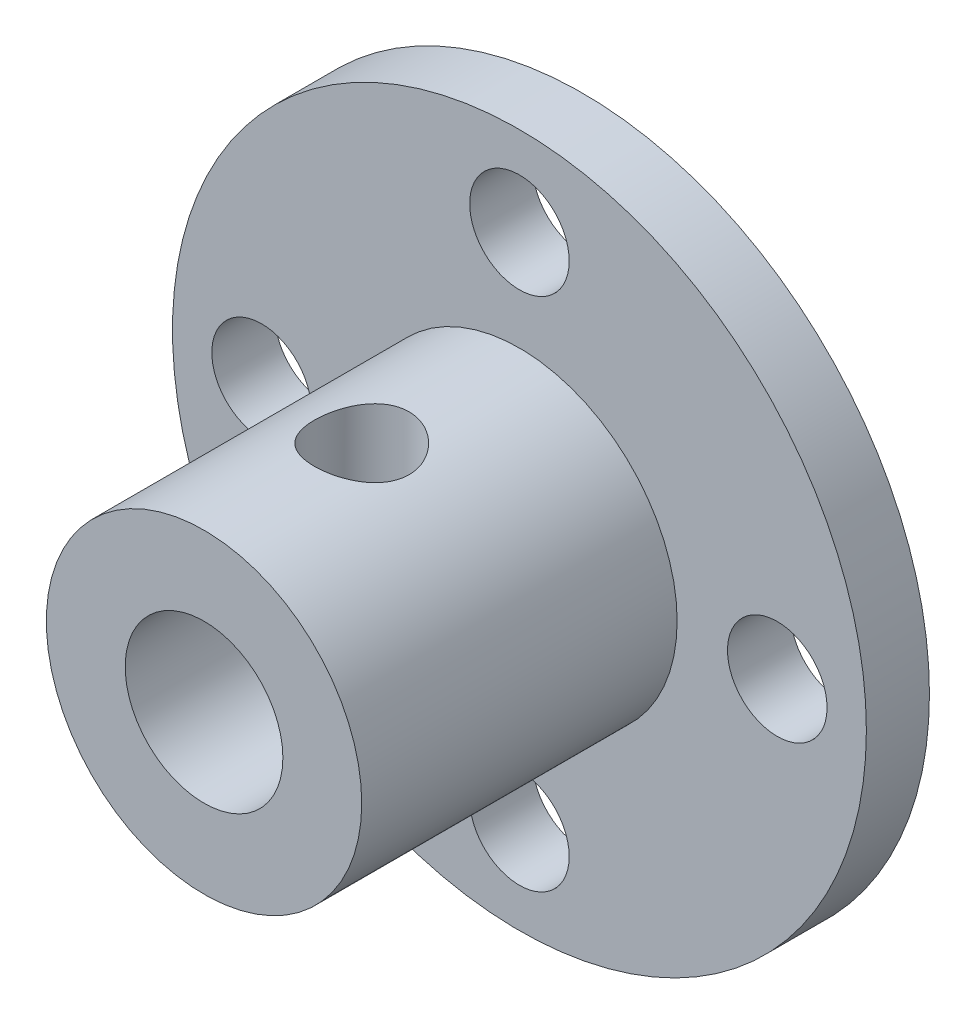
ISO-10303-21;
HEADER;
FILE_DESCRIPTION(('STEP AP214'),'2;1');
FILE_NAME('part.step','',(''),(''),'','','');
FILE_SCHEMA(('AUTOMOTIVE_DESIGN { 1 0 10303 214 1 1 1 1 }'));
ENDSEC;
DATA;
#1=APPLICATION_CONTEXT('core data for automotive mechanical design processes');
#2=APPLICATION_PROTOCOL_DEFINITION('international standard','automotive_design',2000,#1);
#3=PRODUCT_CONTEXT('',#1,'mechanical');
#4=PRODUCT('Part','Part','',(#3));
#5=PRODUCT_RELATED_PRODUCT_CATEGORY('part','',(#4));
#6=PRODUCT_DEFINITION_FORMATION('','',#4);
#7=PRODUCT_DEFINITION_CONTEXT('part definition',#1,'design');
#8=PRODUCT_DEFINITION('design','',#6,#7);
#9=PRODUCT_DEFINITION_SHAPE('','',#8);
#10=(LENGTH_UNIT() NAMED_UNIT(*) SI_UNIT(.MILLI.,.METRE.));
#11=(NAMED_UNIT(*) PLANE_ANGLE_UNIT() SI_UNIT($,.RADIAN.));
#12=(NAMED_UNIT(*) SI_UNIT($,.STERADIAN.) SOLID_ANGLE_UNIT());
#13=UNCERTAINTY_MEASURE_WITH_UNIT(LENGTH_MEASURE(1.E-05),#10,'distance_accuracy_value','');
#14=(GEOMETRIC_REPRESENTATION_CONTEXT(3) GLOBAL_UNCERTAINTY_ASSIGNED_CONTEXT((#13)) GLOBAL_UNIT_ASSIGNED_CONTEXT((#10,
#11,#12)) REPRESENTATION_CONTEXT('',''));
#15=CARTESIAN_POINT('',(0.,0.,0.));
#16=DIRECTION('',(0.,0.,1.));
#17=DIRECTION('',(1.,0.,0.));
#18=AXIS2_PLACEMENT_3D('',#15,#16,#17);
#19=CARTESIAN_POINT('',(0.,0.,2.));
#20=DIRECTION('',(0.,0.,1.));
#21=DIRECTION('',(1.,0.,0.));
#22=AXIS2_PLACEMENT_3D('',#19,#20,#21);
#23=PLANE('',#22);
#24=CARTESIAN_POINT('',(0.,-8.175,2.));
#25=DIRECTION('',(0.,0.,1.));
#26=DIRECTION('',(1.,0.,0.));
#27=AXIS2_PLACEMENT_3D('',#24,#25,#26);
#28=CIRCLE('',#27,1.57807537072648);
#29=CARTESIAN_POINT('',(1.5780753707264,-8.175,2.));
#30=VERTEX_POINT('',#29);
#31=EDGE_CURVE('E129',#30,#30,#28,.T.);
#32=ORIENTED_EDGE('',*,*,#31,.F.);
#33=EDGE_LOOP('',(#32));
#34=FACE_BOUND('',#33,.T.);
#35=CARTESIAN_POINT('',(0.,8.175,2.));
#36=DIRECTION('',(0.,0.,1.));
#37=DIRECTION('',(1.,0.,0.));
#38=AXIS2_PLACEMENT_3D('',#35,#36,#37);
#39=CIRCLE('',#38,1.57807537072648);
#40=CARTESIAN_POINT('',(1.57807537072651,8.175,2.));
#41=VERTEX_POINT('',#40);
#42=EDGE_CURVE('E143',#41,#41,#39,.T.);
#43=ORIENTED_EDGE('',*,*,#42,.F.);
#44=EDGE_LOOP('',(#43));
#45=FACE_BOUND('',#44,.T.);
#46=CARTESIAN_POINT('',(0.,0.,2.));
#47=DIRECTION('',(0.,0.,1.));
#48=DIRECTION('',(1.,0.,0.));
#49=AXIS2_PLACEMENT_3D('',#46,#47,#48);
#50=CIRCLE('',#49,11.);
#51=CARTESIAN_POINT('',(11.,0.,2.));
#52=VERTEX_POINT('',#51);
#53=EDGE_CURVE('E10',#52,#52,#50,.T.);
#54=ORIENTED_EDGE('',*,*,#53,.T.);
#55=EDGE_LOOP('',(#54));
#56=FACE_BOUND('',#55,.T.);
#57=CARTESIAN_POINT('',(-8.175,0.,2.));
#58=DIRECTION('',(0.,0.,1.));
#59=DIRECTION('',(1.,0.,0.));
#60=AXIS2_PLACEMENT_3D('',#57,#58,#59);
#61=CIRCLE('',#60,1.57807537072648);
#62=CARTESIAN_POINT('',(-6.59692462927352,0.,2.));
#63=VERTEX_POINT('',#62);
#64=EDGE_CURVE('E147',#63,#63,#61,.T.);
#65=ORIENTED_EDGE('',*,*,#64,.F.);
#66=EDGE_LOOP('',(#65));
#67=FACE_BOUND('',#66,.T.);
#68=CARTESIAN_POINT('',(8.175,0.,2.));
#69=DIRECTION('',(0.,0.,1.));
#70=DIRECTION('',(1.,0.,0.));
#71=AXIS2_PLACEMENT_3D('',#68,#69,#70);
#72=CIRCLE('',#71,1.57807537072648);
#73=CARTESIAN_POINT('',(9.75307537072649,0.,2.));
#74=VERTEX_POINT('',#73);
#75=EDGE_CURVE('E139',#74,#74,#72,.T.);
#76=ORIENTED_EDGE('',*,*,#75,.F.);
#77=EDGE_LOOP('',(#76));
#78=FACE_BOUND('',#77,.T.);
#79=CARTESIAN_POINT('',(0.,0.,2.));
#80=DIRECTION('',(0.,0.,1.));
#81=DIRECTION('',(1.,0.,0.));
#82=AXIS2_PLACEMENT_3D('',#79,#80,#81);
#83=CIRCLE('',#82,5.);
#84=CARTESIAN_POINT('',(5.,0.,2.));
#85=VERTEX_POINT('',#84);
#86=EDGE_CURVE('E135',#85,#85,#83,.T.);
#87=ORIENTED_EDGE('',*,*,#86,.F.);
#88=EDGE_LOOP('',(#87));
#89=FACE_BOUND('',#88,.T.);
#90=ADVANCED_FACE('F37',(#34,#45,#56,#67,#78,#89),#23,.T.);
#91=CARTESIAN_POINT('',(0.,0.,0.));
#92=DIRECTION('',(0.,0.,1.));
#93=DIRECTION('',(1.,0.,0.));
#94=AXIS2_PLACEMENT_3D('',#91,#92,#93);
#95=PLANE('',#94);
#96=CARTESIAN_POINT('',(0.,0.,0.));
#97=DIRECTION('',(0.,0.,1.));
#98=DIRECTION('',(1.,0.,0.));
#99=AXIS2_PLACEMENT_3D('',#96,#97,#98);
#100=CIRCLE('',#99,11.);
#101=CARTESIAN_POINT('',(11.,0.,0.));
#102=VERTEX_POINT('',#101);
#103=EDGE_CURVE('E50',#102,#102,#100,.T.);
#104=ORIENTED_EDGE('',*,*,#103,.F.);
#105=EDGE_LOOP('',(#104));
#106=FACE_BOUND('',#105,.T.);
#107=CARTESIAN_POINT('',(0.,0.,0.));
#108=DIRECTION('',(0.,0.,1.));
#109=DIRECTION('',(1.,0.,0.));
#110=AXIS2_PLACEMENT_3D('',#107,#108,#109);
#111=CIRCLE('',#110,2.5);
#112=CARTESIAN_POINT('',(2.5,0.,0.));
#113=VERTEX_POINT('',#112);
#114=EDGE_CURVE('E55',#113,#113,#111,.T.);
#115=ORIENTED_EDGE('',*,*,#114,.T.);
#116=EDGE_LOOP('',(#115));
#117=FACE_BOUND('',#116,.T.);
#118=CARTESIAN_POINT('',(-8.175,0.,0.));
#119=DIRECTION('',(0.,0.,1.));
#120=DIRECTION('',(1.,0.,0.));
#121=AXIS2_PLACEMENT_3D('',#118,#119,#120);
#122=CIRCLE('',#121,1.57807537072648);
#123=CARTESIAN_POINT('',(-6.59692462927352,0.,0.));
#124=VERTEX_POINT('',#123);
#125=EDGE_CURVE('E116',#124,#124,#122,.T.);
#126=ORIENTED_EDGE('',*,*,#125,.T.);
#127=EDGE_LOOP('',(#126));
#128=FACE_BOUND('',#127,.T.);
#129=CARTESIAN_POINT('',(0.,8.175,0.));
#130=DIRECTION('',(0.,0.,1.));
#131=DIRECTION('',(1.,0.,0.));
#132=AXIS2_PLACEMENT_3D('',#129,#130,#131);
#133=CIRCLE('',#132,1.57807537072648);
#134=CARTESIAN_POINT('',(1.57807537072651,8.175,0.));
#135=VERTEX_POINT('',#134);
#136=EDGE_CURVE('E120',#135,#135,#133,.T.);
#137=ORIENTED_EDGE('',*,*,#136,.T.);
#138=EDGE_LOOP('',(#137));
#139=FACE_BOUND('',#138,.T.);
#140=CARTESIAN_POINT('',(8.175,0.,0.));
#141=DIRECTION('',(0.,0.,1.));
#142=DIRECTION('',(1.,0.,0.));
#143=AXIS2_PLACEMENT_3D('',#140,#141,#142);
#144=CIRCLE('',#143,1.57807537072648);
#145=CARTESIAN_POINT('',(9.75307537072649,0.,0.));
#146=VERTEX_POINT('',#145);
#147=EDGE_CURVE('E124',#146,#146,#144,.T.);
#148=ORIENTED_EDGE('',*,*,#147,.T.);
#149=EDGE_LOOP('',(#148));
#150=FACE_BOUND('',#149,.T.);
#151=CARTESIAN_POINT('',(0.,-8.175,0.));
#152=DIRECTION('',(0.,0.,1.));
#153=DIRECTION('',(1.,0.,0.));
#154=AXIS2_PLACEMENT_3D('',#151,#152,#153);
#155=CIRCLE('',#154,1.57807537072648);
#156=CARTESIAN_POINT('',(1.5780753707264,-8.175,0.));
#157=VERTEX_POINT('',#156);
#158=EDGE_CURVE('E127',#157,#157,#155,.T.);
#159=ORIENTED_EDGE('',*,*,#158,.T.);
#160=EDGE_LOOP('',(#159));
#161=FACE_BOUND('',#160,.T.);
#162=ADVANCED_FACE('F100',(#106,#117,#128,#139,#150,#161),#95,.F.);
#163=CARTESIAN_POINT('',(0.,0.,2.));
#164=DIRECTION('',(0.,0.,-1.));
#165=DIRECTION('',(-1.,0.,0.));
#166=AXIS2_PLACEMENT_3D('',#163,#164,#165);
#167=CYLINDRICAL_SURFACE('',#166,11.);
#168=ORIENTED_EDGE('',*,*,#53,.F.);
#169=EDGE_LOOP('',(#168));
#170=FACE_BOUND('',#169,.T.);
#171=ORIENTED_EDGE('',*,*,#103,.T.);
#172=EDGE_LOOP('',(#171));
#173=FACE_BOUND('',#172,.T.);
#174=ADVANCED_FACE('F39',(#170,#173),#167,.T.);
#175=CARTESIAN_POINT('',(0.,0.,2.));
#176=DIRECTION('',(0.,0.,-1.));
#177=DIRECTION('',(-1.,0.,0.));
#178=AXIS2_PLACEMENT_3D('',#175,#176,#177);
#179=CYLINDRICAL_SURFACE('',#178,2.5);
#180=CARTESIAN_POINT('',(0.,-2.5,8.5));
#181=CARTESIAN_POINT('',(0.0767298334620157,-2.49999625789733,8.49999590899012));
#182=CARTESIAN_POINT('',(0.153582320644178,-2.4964290461501,8.49407132907374));
#183=CARTESIAN_POINT('',(0.304975509530678,-2.48249903608568,8.47067568048467));
#184=CARTESIAN_POINT('',(0.379510034596047,-2.47211948032719,8.45317613814578));
#185=CARTESIAN_POINT('',(0.523751827790836,-2.44561558054488,8.40761363883315));
#186=CARTESIAN_POINT('',(0.593481028226565,-2.42951973272944,8.37960304183684));
#187=CARTESIAN_POINT('',(0.727030318214657,-2.39295367626407,8.31413966685897));
#188=CARTESIAN_POINT('',(0.790851869416382,-2.37248455380255,8.27668923303126));
#189=CARTESIAN_POINT('',(0.916299278999314,-2.32705360719088,8.19022517329142));
#190=CARTESIAN_POINT('',(0.977384020081414,-2.30186792195985,8.14054630464861));
#191=CARTESIAN_POINT('',(1.09088270411891,-2.25030439279634,8.03253279617173));
#192=CARTESIAN_POINT('',(1.14328534948112,-2.22392505153571,7.97418706281268));
#193=CARTESIAN_POINT('',(1.24444996762974,-2.1691106699591,7.84207648950327));
#194=CARTESIAN_POINT('',(1.29197766378809,-2.14082017703649,7.76729822901871));
#195=CARTESIAN_POINT('',(1.37361437764896,-2.08938301412124,7.60915342675689));
#196=CARTESIAN_POINT('',(1.4077451733516,-2.06622802273938,7.52580110375243));
#197=CARTESIAN_POINT('',(1.45440601714221,-2.0335462966093,7.37340354934676));
#198=CARTESIAN_POINT('',(1.47016197246826,-2.02207883137591,7.30576400138969));
#199=CARTESIAN_POINT('',(1.49216172340475,-2.00590308295503,7.16819628416964));
#200=CARTESIAN_POINT('',(1.49841734556836,-2.00118639643759,7.09827107124551));
#201=CARTESIAN_POINT('',(1.50105508796009,-1.99920922463856,6.95798850578266));
#202=CARTESIAN_POINT('',(1.49741783408419,-2.00196337012718,6.8876305749068));
#203=CARTESIAN_POINT('',(1.48046060478828,-2.01453261443741,6.74872122457241));
#204=CARTESIAN_POINT('',(1.46713334620103,-2.02435302432226,6.68017120415256));
#205=CARTESIAN_POINT('',(1.43173921881792,-2.04953186944258,6.54746975787189));
#206=CARTESIAN_POINT('',(1.40978748666087,-2.06481711652537,6.48327294607552));
#207=CARTESIAN_POINT('',(1.35795061770837,-2.09927051350828,6.35930500907188));
#208=CARTESIAN_POINT('',(1.32806257259705,-2.11844008623465,6.29953551657607));
#209=CARTESIAN_POINT('',(1.25517983184583,-2.16255327268985,6.1750159028772));
#210=CARTESIAN_POINT('',(1.21080724397723,-2.18792043372992,6.11122190704507));
#211=CARTESIAN_POINT('',(1.11291092784003,-2.23930599764381,5.99132351633298));
#212=CARTESIAN_POINT('',(1.05937845100578,-2.26532500262149,5.93522656602349));
#213=CARTESIAN_POINT('',(0.935811834382965,-2.31935504958317,5.82438701817824));
#214=CARTESIAN_POINT('',(0.864517682704955,-2.34713836268532,5.77092269398401));
#215=CARTESIAN_POINT('',(0.712276050458998,-2.39772428433981,5.67687795280209));
#216=CARTESIAN_POINT('',(0.631333763943562,-2.42052955425515,5.63629064621005));
#217=CARTESIAN_POINT('',(0.467197585268205,-2.45730392066151,5.5720678172041));
#218=CARTESIAN_POINT('',(0.384467624173579,-2.47173957439704,5.54752464428409));
#219=CARTESIAN_POINT('',(0.215047895144639,-2.49218842813551,5.51298880259462));
#220=CARTESIAN_POINT('',(0.128363005661318,-2.49821172952738,5.50297868224642));
#221=CARTESIAN_POINT('',(-0.0337146143773973,-2.5009057037461,5.49849215232169));
#222=CARTESIAN_POINT('',(-0.109042473418719,-2.49873521714286,5.50209114491483));
#223=CARTESIAN_POINT('',(-0.257829401986061,-2.48778712087048,5.52042585307192));
#224=CARTESIAN_POINT('',(-0.331288509376106,-2.47900964518037,5.53516134280581));
#225=CARTESIAN_POINT('',(-0.472574932157613,-2.4559479244219,5.57454343281246));
#226=CARTESIAN_POINT('',(-0.540495750928484,-2.44180275662555,5.59894034907347));
#227=CARTESIAN_POINT('',(-0.671265749087263,-2.40913880862844,5.65667737636527));
#228=CARTESIAN_POINT('',(-0.734113924963908,-2.39061916586511,5.69001925134667));
#229=CARTESIAN_POINT('',(-0.860006262823863,-2.3484549623736,5.7685569792087));
#230=CARTESIAN_POINT('',(-0.922394150456837,-2.3244780273988,5.81462382907839));
#231=CARTESIAN_POINT('',(-1.03902603131014,-2.27474265574732,5.91539139348862));
#232=CARTESIAN_POINT('',(-1.09326040273738,-2.2489821658636,5.97010215485254));
#233=CARTESIAN_POINT('',(-1.19931996735579,-2.19445423909891,6.09491039003715));
#234=CARTESIAN_POINT('',(-1.24991019630915,-2.16573241746291,6.1660838854655));
#235=CARTESIAN_POINT('',(-1.33845238915667,-2.1121618206671,6.3172160245682));
#236=CARTESIAN_POINT('',(-1.37641766769781,-2.0873089799769,6.39716529389278));
#237=CARTESIAN_POINT('',(-1.43142578795776,-2.04984909240519,6.54624302230669));
#238=CARTESIAN_POINT('',(-1.4512162533619,-2.03575659328729,6.61398031235859));
#239=CARTESIAN_POINT('',(-1.48113663905972,-2.01409605743544,6.7525320780801));
#240=CARTESIAN_POINT('',(-1.49127995297631,-2.00651897642721,6.82334214432783));
#241=CARTESIAN_POINT('',(-1.50134130416631,-1.99900446616268,6.96637694759703));
#242=CARTESIAN_POINT('',(-1.50122089107869,-1.99909576445937,7.03860599068704));
#243=CARTESIAN_POINT('',(-1.49066472959328,-2.0069771789285,7.18189443560946));
#244=CARTESIAN_POINT('',(-1.48022337215759,-2.0147714813882,7.2529531800806));
#245=CARTESIAN_POINT('',(-1.45040174148913,-2.0363318524298,7.38848841757219));
#246=CARTESIAN_POINT('',(-1.43147636845351,-2.04979211805581,7.45311709430687));
#247=CARTESIAN_POINT('',(-1.38563242076993,-2.08105501960152,7.57833725447422));
#248=CARTESIAN_POINT('',(-1.35871083588479,-2.09885929040482,7.63892720696056));
#249=CARTESIAN_POINT('',(-1.29289245555732,-2.14012990550917,7.76431985722078));
#250=CARTESIAN_POINT('',(-1.25279167675753,-2.1640458758264,7.82834110385431));
#251=CARTESIAN_POINT('',(-1.16375698389084,-2.21320127030768,7.94938007261729));
#252=CARTESIAN_POINT('',(-1.11481579607798,-2.23844177205021,8.00639196215256));
#253=CARTESIAN_POINT('',(-1.00009777425734,-2.29225690291476,8.12135094913168));
#254=CARTESIAN_POINT('',(-0.932876819313902,-2.32070308663658,8.17793107489619));
#255=CARTESIAN_POINT('',(-0.788462434445586,-2.37365428872367,8.27909785586331));
#256=CARTESIAN_POINT('',(-0.711265444501537,-2.39815789310936,8.32368021198479));
#257=CARTESIAN_POINT('',(-0.55112523080145,-2.43985578654394,8.39778580757374));
#258=CARTESIAN_POINT('',(-0.468430086957211,-2.45725077479787,8.42772806492683));
#259=CARTESIAN_POINT('',(-0.297973306118805,-2.48366273001246,8.47272469521098));
#260=CARTESIAN_POINT('',(-0.21023209964861,-2.49271125871485,8.48783516785699));
#261=CARTESIAN_POINT('',(-0.101558096917534,-2.49802001168187,8.49669745470866));
#262=CARTESIAN_POINT('',(-0.0812762590282757,-2.49876114656362,8.4979344173061));
#263=CARTESIAN_POINT('',(-0.0406658206871114,-2.49975164517367,8.49958624637086));
#264=CARTESIAN_POINT('',(-0.020337218637569,-2.50000099184316,8.50000108432091));
#265=CARTESIAN_POINT('',(0.,-2.5,8.5));
#266=B_SPLINE_CURVE_WITH_KNOTS('',3,(#180,#181,#182,#183,#184,#185,#186,#187,#188,#189,#190,
#191,#192,#193,#194,#195,#196,#197,#198,#199,#200,#201,#202,#203,#204,#205,#206,#207,#208,#209,
#210,#211,#212,#213,#214,#215,#216,#217,#218,#219,#220,#221,#222,#223,#224,#225,#226,#227,#228,
#229,#230,#231,#232,#233,#234,#235,#236,#237,#238,#239,#240,#241,#242,#243,#244,#245,#246,#247,
#248,#249,#250,#251,#252,#253,#254,#255,#256,#257,#258,#259,#260,#261,#262,#263,#264,#265),
.UNSPECIFIED.,.T.,.F.,(4,2,2,2,2,2,2,2,2,2,2,2,2,2,2,2,2,2,2,2,2,2,2,2,2,2,2,2,2,2,2,2,2,2,2,2,
2,2,2,2,2,2,4),(0.,0.230102237548649,0.460772627520011,0.690308884600011,0.919788197992273,
1.16681590732472,1.414162579348,1.69183813189807,1.96906040692091,2.17933829855633,
2.38935420916578,2.59978170870726,2.81036753273872,3.01823267593207,3.22617409809869,
3.47046995225163,3.71500044803674,3.99360957884691,4.27206939275324,4.5329679069656,
4.79355286918236,5.01875602722426,5.24395461863455,5.46367785689772,5.68344445659025,
5.92601365818362,6.16886690081836,6.44336762428009,6.71757792616456,6.93257787314692,
7.14727888733319,7.36278425777433,7.57840681155725,7.78364098331142,7.98895251523035,
8.22578610052286,8.46281544370208,8.73854311775519,9.01436946031985,9.28175654462677,
9.54812832184448,9.60911473335177,9.6701032602764),.UNSPECIFIED.);
#267=CARTESIAN_POINT('',(0.,-2.5,8.5));
#268=VERTEX_POINT('',#267);
#269=EDGE_CURVE('E85',#268,#268,#266,.T.);
#270=ORIENTED_EDGE('',*,*,#269,.F.);
#271=EDGE_LOOP('',(#270));
#272=FACE_BOUND('',#271,.T.);
#273=CARTESIAN_POINT('',(0.,2.5,8.5));
#274=CARTESIAN_POINT('',(-0.076729833462016,2.49999625789732,8.49999590899012));
#275=CARTESIAN_POINT('',(-0.153582320644178,2.4964290461501,8.49407132907374));
#276=CARTESIAN_POINT('',(-0.304975509530679,2.48249903608568,8.47067568048467));
#277=CARTESIAN_POINT('',(-0.379510034596047,2.47211948032719,8.45317613814578));
#278=CARTESIAN_POINT('',(-0.523751827790837,2.44561558054488,8.40761363883314));
#279=CARTESIAN_POINT('',(-0.593481028226567,2.42951973272944,8.37960304183684));
#280=CARTESIAN_POINT('',(-0.72703031821466,2.39295367626407,8.31413966685897));
#281=CARTESIAN_POINT('',(-0.790851869416384,2.37248455380255,8.27668923303125));
#282=CARTESIAN_POINT('',(-0.916299278999316,2.32705360719088,8.19022517329142));
#283=CARTESIAN_POINT('',(-0.977384020081416,2.30186792195985,8.14054630464861));
#284=CARTESIAN_POINT('',(-1.09088270411891,2.25030439279634,8.03253279617173));
#285=CARTESIAN_POINT('',(-1.14328534948112,2.22392505153571,7.97418706281268));
#286=CARTESIAN_POINT('',(-1.24444996762974,2.1691106699591,7.84207648950327));
#287=CARTESIAN_POINT('',(-1.29197766378809,2.14082017703649,7.76729822901871));
#288=CARTESIAN_POINT('',(-1.37361437764896,2.08938301412124,7.60915342675689));
#289=CARTESIAN_POINT('',(-1.4077451733516,2.06622802273938,7.52580110375243));
#290=CARTESIAN_POINT('',(-1.45440601714222,2.0335462966093,7.37340354934676));
#291=CARTESIAN_POINT('',(-1.47016197246826,2.02207883137591,7.30576400138968));
#292=CARTESIAN_POINT('',(-1.49216172340475,2.00590308295503,7.16819628416964));
#293=CARTESIAN_POINT('',(-1.49841734556836,2.00118639643759,7.09827107124551));
#294=CARTESIAN_POINT('',(-1.50105508796009,1.99920922463856,6.95798850578266));
#295=CARTESIAN_POINT('',(-1.49741783408419,2.00196337012718,6.8876305749068));
#296=CARTESIAN_POINT('',(-1.48046060478828,2.01453261443741,6.74872122457241));
#297=CARTESIAN_POINT('',(-1.46713334620103,2.02435302432226,6.68017120415256));
#298=CARTESIAN_POINT('',(-1.43173921881792,2.04953186944258,6.54746975787189));
#299=CARTESIAN_POINT('',(-1.40978748666087,2.06481711652537,6.48327294607552));
#300=CARTESIAN_POINT('',(-1.35795061770837,2.09927051350828,6.35930500907188));
#301=CARTESIAN_POINT('',(-1.32806257259705,2.11844008623465,6.29953551657608));
#302=CARTESIAN_POINT('',(-1.25517983184583,2.16255327268985,6.1750159028772));
#303=CARTESIAN_POINT('',(-1.21080724397723,2.18792043372992,6.11122190704507));
#304=CARTESIAN_POINT('',(-1.11291092784003,2.23930599764381,5.99132351633298));
#305=CARTESIAN_POINT('',(-1.05937845100579,2.26532500262149,5.93522656602349));
#306=CARTESIAN_POINT('',(-0.935811834382967,2.31935504958317,5.82438701817824));
#307=CARTESIAN_POINT('',(-0.864517682704957,2.34713836268532,5.77092269398401));
#308=CARTESIAN_POINT('',(-0.712276050459,2.39772428433981,5.67687795280209));
#309=CARTESIAN_POINT('',(-0.631333763943564,2.42052955425515,5.63629064621005));
#310=CARTESIAN_POINT('',(-0.467197585268206,2.45730392066151,5.5720678172041));
#311=CARTESIAN_POINT('',(-0.38446762417358,2.47173957439704,5.54752464428409));
#312=CARTESIAN_POINT('',(-0.21504789514464,2.49218842813551,5.51298880259462));
#313=CARTESIAN_POINT('',(-0.128363005661319,2.49821172952738,5.50297868224642));
#314=CARTESIAN_POINT('',(0.0337146143773959,2.5009057037461,5.49849215232169));
#315=CARTESIAN_POINT('',(0.109042473418717,2.49873521714286,5.50209114491483));
#316=CARTESIAN_POINT('',(0.25782940198606,2.48778712087048,5.52042585307192));
#317=CARTESIAN_POINT('',(0.331288509376106,2.47900964518037,5.53516134280581));
#318=CARTESIAN_POINT('',(0.472574932157613,2.4559479244219,5.57454343281246));
#319=CARTESIAN_POINT('',(0.540495750928484,2.44180275662555,5.59894034907347));
#320=CARTESIAN_POINT('',(0.671265749087263,2.40913880862844,5.65667737636527));
#321=CARTESIAN_POINT('',(0.734113924963909,2.39061916586511,5.69001925134667));
#322=CARTESIAN_POINT('',(0.860006262823864,2.3484549623736,5.76855697920871));
#323=CARTESIAN_POINT('',(0.922394150456837,2.3244780273988,5.81462382907839));
#324=CARTESIAN_POINT('',(1.03902603131014,2.27474265574732,5.91539139348862));
#325=CARTESIAN_POINT('',(1.09326040273738,2.2489821658636,5.97010215485254));
#326=CARTESIAN_POINT('',(1.19931996735579,2.19445423909891,6.09491039003715));
#327=CARTESIAN_POINT('',(1.24991019630915,2.16573241746291,6.1660838854655));
#328=CARTESIAN_POINT('',(1.33845238915668,2.1121618206671,6.31721602456821));
#329=CARTESIAN_POINT('',(1.37641766769781,2.0873089799769,6.39716529389279));
#330=CARTESIAN_POINT('',(1.43142578795776,2.04984909240519,6.54624302230669));
#331=CARTESIAN_POINT('',(1.4512162533619,2.03575659328728,6.61398031235859));
#332=CARTESIAN_POINT('',(1.48113663905972,2.01409605743544,6.75253207808011));
#333=CARTESIAN_POINT('',(1.49127995297631,2.00651897642721,6.82334214432783));
#334=CARTESIAN_POINT('',(1.50134130416631,1.99900446616268,6.96637694759703));
#335=CARTESIAN_POINT('',(1.50122089107869,1.99909576445937,7.03860599068704));
#336=CARTESIAN_POINT('',(1.49066472959328,2.0069771789285,7.18189443560946));
#337=CARTESIAN_POINT('',(1.48022337215759,2.0147714813882,7.2529531800806));
#338=CARTESIAN_POINT('',(1.45040174148913,2.0363318524298,7.38848841757219));
#339=CARTESIAN_POINT('',(1.43147636845351,2.04979211805581,7.45311709430687));
#340=CARTESIAN_POINT('',(1.38563242076993,2.08105501960151,7.57833725447422));
#341=CARTESIAN_POINT('',(1.35871083588479,2.09885929040482,7.63892720696055));
#342=CARTESIAN_POINT('',(1.29289245555732,2.14012990550917,7.76431985722078));
#343=CARTESIAN_POINT('',(1.25279167675753,2.16404587582639,7.82834110385431));
#344=CARTESIAN_POINT('',(1.16375698389085,2.21320127030768,7.94938007261729));
#345=CARTESIAN_POINT('',(1.11481579607798,2.23844177205021,8.00639196215256));
#346=CARTESIAN_POINT('',(1.00009777425734,2.29225690291476,8.12135094913167));
#347=CARTESIAN_POINT('',(0.932876819313905,2.32070308663658,8.17793107489619));
#348=CARTESIAN_POINT('',(0.78846243444559,2.37365428872367,8.27909785586331));
#349=CARTESIAN_POINT('',(0.711265444501541,2.39815789310936,8.32368021198479));
#350=CARTESIAN_POINT('',(0.551125230801454,2.43985578654394,8.39778580757374));
#351=CARTESIAN_POINT('',(0.468430086957215,2.45725077479787,8.42772806492683));
#352=CARTESIAN_POINT('',(0.297973306118808,2.48366273001246,8.47272469521097));
#353=CARTESIAN_POINT('',(0.210232099648613,2.49271125871485,8.48783516785699));
#354=CARTESIAN_POINT('',(0.101558096917537,2.49802001168187,8.49669745470866));
#355=CARTESIAN_POINT('',(0.081276259028278,2.49876114656362,8.4979344173061));
#356=CARTESIAN_POINT('',(0.0406658206871126,2.49975164517367,8.49958624637086));
#357=CARTESIAN_POINT('',(0.0203372186375696,2.50000099184316,8.50000108432091));
#358=CARTESIAN_POINT('',(0.,2.5,8.5));
#359=B_SPLINE_CURVE_WITH_KNOTS('',3,(#273,#274,#275,#276,#277,#278,#279,#280,#281,#282,#283,
#284,#285,#286,#287,#288,#289,#290,#291,#292,#293,#294,#295,#296,#297,#298,#299,#300,#301,#302,
#303,#304,#305,#306,#307,#308,#309,#310,#311,#312,#313,#314,#315,#316,#317,#318,#319,#320,#321,
#322,#323,#324,#325,#326,#327,#328,#329,#330,#331,#332,#333,#334,#335,#336,#337,#338,#339,#340,
#341,#342,#343,#344,#345,#346,#347,#348,#349,#350,#351,#352,#353,#354,#355,#356,#357,#358),
.UNSPECIFIED.,.T.,.F.,(4,2,2,2,2,2,2,2,2,2,2,2,2,2,2,2,2,2,2,2,2,2,2,2,2,2,2,2,2,2,2,2,2,2,2,2,
2,2,2,2,2,2,4),(0.,0.230102237548649,0.460772627520013,0.690308884600013,0.919788197992276,
1.16681590732473,1.41416257934801,1.69183813189807,1.96906040692092,2.17933829855633,
2.38935420916578,2.59978170870726,2.81036753273872,3.01823267593207,3.22617409809868,
3.47046995225163,3.71500044803674,3.99360957884691,4.27206939275324,4.53296790696559,
4.79355286918236,5.01875602722426,5.24395461863455,5.46367785689772,5.68344445659025,
5.92601365818362,6.16886690081836,6.44336762428009,6.71757792616456,6.93257787314693,
7.14727888733319,7.36278425777433,7.57840681155725,7.78364098331142,7.98895251523035,
8.22578610052286,8.46281544370208,8.73854311775519,9.01436946031985,9.28175654462677,
9.54812832184448,9.60911473335177,9.6701032602764),.UNSPECIFIED.);
#360=CARTESIAN_POINT('',(0.,2.5,8.5));
#361=VERTEX_POINT('',#360);
#362=EDGE_CURVE('E79',#361,#361,#359,.T.);
#363=ORIENTED_EDGE('',*,*,#362,.F.);
#364=EDGE_LOOP('',(#363));
#365=FACE_BOUND('',#364,.T.);
#366=ORIENTED_EDGE('',*,*,#114,.F.);
#367=EDGE_LOOP('',(#366));
#368=FACE_BOUND('',#367,.T.);
#369=CARTESIAN_POINT('',(0.,0.,12.));
#370=DIRECTION('',(0.,0.,1.));
#371=DIRECTION('',(1.,0.,0.));
#372=AXIS2_PLACEMENT_3D('',#369,#370,#371);
#373=CIRCLE('',#372,2.5);
#374=CARTESIAN_POINT('',(2.5,0.,12.));
#375=VERTEX_POINT('',#374);
#376=EDGE_CURVE('E159',#375,#375,#373,.T.);
#377=ORIENTED_EDGE('',*,*,#376,.T.);
#378=EDGE_LOOP('',(#377));
#379=FACE_BOUND('',#378,.T.);
#380=ADVANCED_FACE('F90',(#272,#365,#368,#379),#179,.F.);
#381=CARTESIAN_POINT('',(-8.175,0.,2.));
#382=DIRECTION('',(0.,0.,-1.));
#383=DIRECTION('',(-1.,0.,0.));
#384=AXIS2_PLACEMENT_3D('',#381,#382,#383);
#385=CYLINDRICAL_SURFACE('',#384,1.57807537072648);
#386=ORIENTED_EDGE('',*,*,#64,.T.);
#387=EDGE_LOOP('',(#386));
#388=FACE_BOUND('',#387,.T.);
#389=ORIENTED_EDGE('',*,*,#125,.F.);
#390=EDGE_LOOP('',(#389));
#391=FACE_BOUND('',#390,.T.);
#392=ADVANCED_FACE('F95',(#388,#391),#385,.F.);
#393=CARTESIAN_POINT('',(0.,8.175,2.));
#394=DIRECTION('',(0.,0.,-1.));
#395=DIRECTION('',(-1.,0.,0.));
#396=AXIS2_PLACEMENT_3D('',#393,#394,#395);
#397=CYLINDRICAL_SURFACE('',#396,1.57807537072648);
#398=ORIENTED_EDGE('',*,*,#42,.T.);
#399=EDGE_LOOP('',(#398));
#400=FACE_BOUND('',#399,.T.);
#401=ORIENTED_EDGE('',*,*,#136,.F.);
#402=EDGE_LOOP('',(#401));
#403=FACE_BOUND('',#402,.T.);
#404=ADVANCED_FACE('F190',(#400,#403),#397,.F.);
#405=CARTESIAN_POINT('',(8.175,0.,2.));
#406=DIRECTION('',(0.,0.,-1.));
#407=DIRECTION('',(-1.,0.,0.));
#408=AXIS2_PLACEMENT_3D('',#405,#406,#407);
#409=CYLINDRICAL_SURFACE('',#408,1.57807537072648);
#410=ORIENTED_EDGE('',*,*,#75,.T.);
#411=EDGE_LOOP('',(#410));
#412=FACE_BOUND('',#411,.T.);
#413=ORIENTED_EDGE('',*,*,#147,.F.);
#414=EDGE_LOOP('',(#413));
#415=FACE_BOUND('',#414,.T.);
#416=ADVANCED_FACE('F185',(#412,#415),#409,.F.);
#417=CARTESIAN_POINT('',(0.,-8.175,2.));
#418=DIRECTION('',(0.,0.,-1.));
#419=DIRECTION('',(-1.,0.,0.));
#420=AXIS2_PLACEMENT_3D('',#417,#418,#419);
#421=CYLINDRICAL_SURFACE('',#420,1.57807537072648);
#422=ORIENTED_EDGE('',*,*,#31,.T.);
#423=EDGE_LOOP('',(#422));
#424=FACE_BOUND('',#423,.T.);
#425=ORIENTED_EDGE('',*,*,#158,.F.);
#426=EDGE_LOOP('',(#425));
#427=FACE_BOUND('',#426,.T.);
#428=ADVANCED_FACE('F181',(#424,#427),#421,.F.);
#429=CARTESIAN_POINT('',(0.,0.,12.));
#430=DIRECTION('',(0.,0.,1.));
#431=DIRECTION('',(1.,0.,0.));
#432=AXIS2_PLACEMENT_3D('',#429,#430,#431);
#433=PLANE('',#432);
#434=CARTESIAN_POINT('',(0.,0.,12.));
#435=DIRECTION('',(0.,0.,1.));
#436=DIRECTION('',(1.,0.,0.));
#437=AXIS2_PLACEMENT_3D('',#434,#435,#436);
#438=CIRCLE('',#437,5.);
#439=CARTESIAN_POINT('',(5.,0.,12.));
#440=VERTEX_POINT('',#439);
#441=EDGE_CURVE('E130',#440,#440,#438,.T.);
#442=ORIENTED_EDGE('',*,*,#441,.T.);
#443=EDGE_LOOP('',(#442));
#444=FACE_BOUND('',#443,.T.);
#445=ORIENTED_EDGE('',*,*,#376,.F.);
#446=EDGE_LOOP('',(#445));
#447=FACE_BOUND('',#446,.T.);
#448=ADVANCED_FACE('F73',(#444,#447),#433,.T.);
#449=CARTESIAN_POINT('',(0.,0.,12.));
#450=DIRECTION('',(0.,0.,-1.));
#451=DIRECTION('',(-1.,0.,0.));
#452=AXIS2_PLACEMENT_3D('',#449,#450,#451);
#453=CYLINDRICAL_SURFACE('',#452,5.);
#454=CARTESIAN_POINT('',(0.,-5.,8.5));
#455=CARTESIAN_POINT('',(0.0822886127532999,-4.9999992925055,8.49999900251511));
#456=CARTESIAN_POINT('',(0.164587318351529,-4.99794915693954,8.49320613637603));
#457=CARTESIAN_POINT('',(0.32678812530488,-4.98997105593691,8.4662786457779));
#458=CARTESIAN_POINT('',(0.40668950441142,-4.98404193389692,8.44614004197666));
#459=CARTESIAN_POINT('',(0.561732707754526,-4.96895552501836,8.39325398308974));
#460=CARTESIAN_POINT('',(0.636881364395373,-4.95980300250425,8.36052513038107));
#461=CARTESIAN_POINT('',(0.780624181053131,-4.93922109237645,8.28346390694417));
#462=CARTESIAN_POINT('',(0.849217467469669,-4.92779140192067,8.23912999260458));
#463=CARTESIAN_POINT('',(0.979871797183745,-4.90350737192774,8.13877599252733));
#464=CARTESIAN_POINT('',(1.04171807124434,-4.89062383657036,8.08248337411409));
#465=CARTESIAN_POINT('',(1.15524920923324,-4.86505834210442,7.96039077008982));
#466=CARTESIAN_POINT('',(1.20693236327441,-4.85237641724501,7.89458918787504));
#467=CARTESIAN_POINT('',(1.29980037723708,-4.82834113993772,7.75352924696239));
#468=CARTESIAN_POINT('',(1.34072309022213,-4.81702406663875,7.67809153900926));
#469=CARTESIAN_POINT('',(1.4092139477476,-4.79743620394031,7.52101074576971));
#470=CARTESIAN_POINT('',(1.43678529919973,-4.78916468313311,7.43936915607203));
#471=CARTESIAN_POINT('',(1.47701633682652,-4.77690870838434,7.27460973386954));
#472=CARTESIAN_POINT('',(1.49007196234677,-4.77281069324533,7.19159725613606));
#473=CARTESIAN_POINT('',(1.50213730614672,-4.76902789749767,7.02446684378324));
#474=CARTESIAN_POINT('',(1.50115042761078,-4.76934204760571,6.94034918194091));
#475=CARTESIAN_POINT('',(1.48546977199812,-4.77424744067778,6.77661609139152));
#476=CARTESIAN_POINT('',(1.47127205262685,-4.7786838859914,6.69694774963776));
#477=CARTESIAN_POINT('',(1.43037420427056,-4.79108356228624,6.54118021372654));
#478=CARTESIAN_POINT('',(1.40367284141641,-4.79904714132351,6.46508137262567));
#479=CARTESIAN_POINT('',(1.33816026653682,-4.81772733074973,6.31739965033926));
#480=CARTESIAN_POINT('',(1.29918816934642,-4.82848016115952,6.24589291604474));
#481=CARTESIAN_POINT('',(1.21035222588683,-4.85150987000065,6.11026797798981));
#482=CARTESIAN_POINT('',(1.16048574002588,-4.86378711746991,6.04615157058622));
#483=CARTESIAN_POINT('',(1.04881290765546,-4.88911011297937,5.92431380923798));
#484=CARTESIAN_POINT('',(0.986594907466972,-4.90216654310498,5.86697133597033));
#485=CARTESIAN_POINT('',(0.853263259313967,-4.92712244063259,5.76344601593575));
#486=CARTESIAN_POINT('',(0.782149051860888,-4.9390218351841,5.71726387158557));
#487=CARTESIAN_POINT('',(0.632355038342803,-4.9604316006947,5.63714007753527));
#488=CARTESIAN_POINT('',(0.55362774974795,-4.96992543668314,5.60328248375014));
#489=CARTESIAN_POINT('',(0.391245415603519,-4.98533521832222,5.54940040990037));
#490=CARTESIAN_POINT('',(0.307591751589581,-4.99125216186999,5.52937207146751));
#491=CARTESIAN_POINT('',(0.140952242668331,-4.99868364643538,5.50434782210061));
#492=CARTESIAN_POINT('',(0.0580500976011868,-5.0003485041779,5.49883841419839));
#493=CARTESIAN_POINT('',(-0.107499605823383,-4.9995292324176,5.50156915571208));
#494=CARTESIAN_POINT('',(-0.19014719669078,-4.99704565677756,5.50980746965144));
#495=CARTESIAN_POINT('',(-0.350903605309697,-4.98830696987163,5.5393846111115));
#496=CARTESIAN_POINT('',(-0.429072772614169,-4.98213829799417,5.56042338758087));
#497=CARTESIAN_POINT('',(-0.580754638954521,-4.96674347841533,5.6146432327782));
#498=CARTESIAN_POINT('',(-0.654266777025583,-4.95751696321085,5.64782576103786));
#499=CARTESIAN_POINT('',(-0.796437189461052,-4.93669654351325,5.72625316548113));
#500=CARTESIAN_POINT('',(-0.864943826199669,-4.92505280829675,5.77175934094797));
#501=CARTESIAN_POINT('',(-0.993523307980146,-4.90073468764318,5.87322475405281));
#502=CARTESIAN_POINT('',(-1.05359403235593,-4.8880600443108,5.92918661188767));
#503=CARTESIAN_POINT('',(-1.16585744551027,-4.86253171869138,6.05238730836934));
#504=CARTESIAN_POINT('',(-1.21768481231503,-4.84968825033268,6.11996187577174));
#505=CARTESIAN_POINT('',(-1.30928995072154,-4.82576515238464,6.26312793901353));
#506=CARTESIAN_POINT('',(-1.34906803829472,-4.81468547654651,6.33871922455821));
#507=CARTESIAN_POINT('',(-1.41517347127168,-4.79567189615055,6.49553249125469));
#508=CARTESIAN_POINT('',(-1.4415634693705,-4.78772337843827,6.57672618653659));
#509=CARTESIAN_POINT('',(-1.48021730815114,-4.77591594362794,6.74268796893148));
#510=CARTESIAN_POINT('',(-1.49248598978779,-4.772055625083,6.82745482078767));
#511=CARTESIAN_POINT('',(-1.50221984485059,-4.76899972496087,6.99436151837623));
#512=CARTESIAN_POINT('',(-1.5002805530849,-4.76961647442754,7.07646365101759));
#513=CARTESIAN_POINT('',(-1.48307505444813,-4.77499401288294,7.2391141033728));
#514=CARTESIAN_POINT('',(-1.46780938124716,-4.77975463592551,7.31966248517635));
#515=CARTESIAN_POINT('',(-1.42476888804136,-4.79275763670386,7.47594539914285));
#516=CARTESIAN_POINT('',(-1.39715175507068,-4.80095604545965,7.55172728736169));
#517=CARTESIAN_POINT('',(-1.33031507121129,-4.81990278909136,7.69764243881772));
#518=CARTESIAN_POINT('',(-1.29109329962876,-4.83065161194312,7.76777461764076));
#519=CARTESIAN_POINT('',(-1.20048763805072,-4.85397676425833,7.90316311652711));
#520=CARTESIAN_POINT('',(-1.14871276092994,-4.86660540163798,7.96814876126041));
#521=CARTESIAN_POINT('',(-1.03517434629782,-4.89201320450026,8.08870249830786));
#522=CARTESIAN_POINT('',(-0.973408217134501,-4.90479240823905,8.14426813946776));
#523=CARTESIAN_POINT('',(-0.839465762183248,-4.92950936570649,8.24602341229503));
#524=CARTESIAN_POINT('',(-0.767037885790608,-4.94141159765674,8.29189144685549));
#525=CARTESIAN_POINT('',(-0.61514137398353,-4.96260680455813,8.37073516990402));
#526=CARTESIAN_POINT('',(-0.535676052998955,-4.97190099931067,8.40371688827451));
#527=CARTESIAN_POINT('',(-0.380757712655281,-4.98602174969301,8.45289527565275));
#528=CARTESIAN_POINT('',(-0.305786961954234,-4.99122027381068,8.47051167288325));
#529=CARTESIAN_POINT('',(-0.153880195230779,-4.99820944494492,8.49406352524158));
#530=CARTESIAN_POINT('',(-0.0769445098581396,-5.0000006615474,8.50000093270482));
#531=CARTESIAN_POINT('',(0.,-5.,8.5));
#532=B_SPLINE_CURVE_WITH_KNOTS('',3,(#454,#455,#456,#457,#458,#459,#460,#461,#462,#463,#464,
#465,#466,#467,#468,#469,#470,#471,#472,#473,#474,#475,#476,#477,#478,#479,#480,#481,#482,#483,
#484,#485,#486,#487,#488,#489,#490,#491,#492,#493,#494,#495,#496,#497,#498,#499,#500,#501,#502,
#503,#504,#505,#506,#507,#508,#509,#510,#511,#512,#513,#514,#515,#516,#517,#518,#519,#520,#521,
#522,#523,#524,#525,#526,#527,#528,#529,#530,#531),.UNSPECIFIED.,.T.,.F.,(4,2,2,2,2,2,2,2,2,2,2,
2,2,2,2,2,2,2,2,2,2,2,2,2,2,2,2,2,2,2,2,2,2,2,2,2,2,2,4),(0.,0.24658320361261,0.493239964845999,
0.739533676300874,0.985860164412702,1.23855602948191,1.49129437288633,1.74971481004109,
2.00807314543224,2.25919689356599,2.51025978319089,2.75226016697676,2.99428443658001,
3.23962426447119,3.48502360158555,3.74067104048167,3.99633456531072,4.25371046881689,
4.51101453528808,4.75908809438545,5.00712853550327,5.24956746682327,5.49203554593729,
5.74011305702908,5.98825282000191,6.24540400322819,6.50254844252681,6.75847814951252,
7.01432009460283,7.25950155466943,7.504673196616,7.74680040402721,7.98897397553107,
8.23996925679931,8.49102974897502,8.74942996156671,9.00770911595235,9.2383169193046,
9.46888616948875),.UNSPECIFIED.);
#533=CARTESIAN_POINT('',(0.,-5.,8.5));
#534=VERTEX_POINT('',#533);
#535=EDGE_CURVE('E41',#534,#534,#532,.T.);
#536=ORIENTED_EDGE('',*,*,#535,.T.);
#537=EDGE_LOOP('',(#536));
#538=FACE_BOUND('',#537,.T.);
#539=CARTESIAN_POINT('',(0.,5.,8.5));
#540=CARTESIAN_POINT('',(-0.0822886127532999,4.99999929250549,8.49999900251511));
#541=CARTESIAN_POINT('',(-0.164587318351529,4.99794915693953,8.49320613637603));
#542=CARTESIAN_POINT('',(-0.326788125304881,4.98997105593691,8.4662786457779));
#543=CARTESIAN_POINT('',(-0.40668950441142,4.98404193389692,8.44614004197666));
#544=CARTESIAN_POINT('',(-0.561732707754527,4.96895552501836,8.39325398308974));
#545=CARTESIAN_POINT('',(-0.636881364395374,4.95980300250425,8.36052513038107));
#546=CARTESIAN_POINT('',(-0.780624181053132,4.93922109237645,8.28346390694417));
#547=CARTESIAN_POINT('',(-0.84921746746967,4.92779140192067,8.23912999260458));
#548=CARTESIAN_POINT('',(-0.979871797183745,4.90350737192774,8.13877599252733));
#549=CARTESIAN_POINT('',(-1.04171807124434,4.89062383657036,8.08248337411409));
#550=CARTESIAN_POINT('',(-1.15524920923324,4.86505834210442,7.96039077008981));
#551=CARTESIAN_POINT('',(-1.20693236327441,4.85237641724501,7.89458918787504));
#552=CARTESIAN_POINT('',(-1.29980037723708,4.82834113993772,7.75352924696239));
#553=CARTESIAN_POINT('',(-1.34072309022214,4.81702406663875,7.67809153900926));
#554=CARTESIAN_POINT('',(-1.4092139477476,4.79743620394031,7.52101074576971));
#555=CARTESIAN_POINT('',(-1.43678529919973,4.78916468313311,7.43936915607202));
#556=CARTESIAN_POINT('',(-1.47701633682652,4.77690870838434,7.27460973386954));
#557=CARTESIAN_POINT('',(-1.49007196234677,4.77281069324533,7.19159725613606));
#558=CARTESIAN_POINT('',(-1.50213730614672,4.76902789749767,7.02446684378323));
#559=CARTESIAN_POINT('',(-1.50115042761078,4.76934204760571,6.94034918194091));
#560=CARTESIAN_POINT('',(-1.48546977199812,4.77424744067778,6.77661609139152));
#561=CARTESIAN_POINT('',(-1.47127205262685,4.7786838859914,6.69694774963776));
#562=CARTESIAN_POINT('',(-1.43037420427056,4.79108356228624,6.54118021372654));
#563=CARTESIAN_POINT('',(-1.40367284141641,4.79904714132351,6.46508137262567));
#564=CARTESIAN_POINT('',(-1.33816026653682,4.81772733074973,6.31739965033926));
#565=CARTESIAN_POINT('',(-1.29918816934642,4.82848016115952,6.24589291604474));
#566=CARTESIAN_POINT('',(-1.21035222588683,4.85150987000065,6.11026797798981));
#567=CARTESIAN_POINT('',(-1.16048574002588,4.86378711746991,6.04615157058622));
#568=CARTESIAN_POINT('',(-1.04881290765546,4.88911011297937,5.92431380923798));
#569=CARTESIAN_POINT('',(-0.986594907466971,4.90216654310498,5.86697133597033));
#570=CARTESIAN_POINT('',(-0.853263259313966,4.92712244063259,5.76344601593575));
#571=CARTESIAN_POINT('',(-0.782149051860887,4.9390218351841,5.71726387158557));
#572=CARTESIAN_POINT('',(-0.632355038342802,4.9604316006947,5.63714007753527));
#573=CARTESIAN_POINT('',(-0.553627749747949,4.96992543668314,5.60328248375014));
#574=CARTESIAN_POINT('',(-0.391245415603518,4.98533521832222,5.54940040990037));
#575=CARTESIAN_POINT('',(-0.307591751589581,4.99125216186999,5.52937207146751));
#576=CARTESIAN_POINT('',(-0.140952242668331,4.99868364643538,5.50434782210061));
#577=CARTESIAN_POINT('',(-0.0580500976011861,5.0003485041779,5.49883841419839));
#578=CARTESIAN_POINT('',(0.107499605823384,4.9995292324176,5.50156915571208));
#579=CARTESIAN_POINT('',(0.190147196690782,4.99704565677756,5.50980746965144));
#580=CARTESIAN_POINT('',(0.350903605309698,4.98830696987163,5.5393846111115));
#581=CARTESIAN_POINT('',(0.42907277261417,4.98213829799417,5.56042338758087));
#582=CARTESIAN_POINT('',(0.580754638954523,4.96674347841533,5.6146432327782));
#583=CARTESIAN_POINT('',(0.654266777025585,4.95751696321085,5.64782576103786));
#584=CARTESIAN_POINT('',(0.796437189461053,4.93669654351325,5.72625316548113));
#585=CARTESIAN_POINT('',(0.864943826199671,4.92505280829675,5.77175934094797));
#586=CARTESIAN_POINT('',(0.993523307980148,4.90073468764317,5.87322475405281));
#587=CARTESIAN_POINT('',(1.05359403235594,4.8880600443108,5.92918661188767));
#588=CARTESIAN_POINT('',(1.16585744551027,4.86253171869138,6.05238730836935));
#589=CARTESIAN_POINT('',(1.21768481231504,4.84968825033268,6.11996187577174));
#590=CARTESIAN_POINT('',(1.30928995072154,4.82576515238463,6.26312793901353));
#591=CARTESIAN_POINT('',(1.34906803829472,4.81468547654651,6.33871922455822));
#592=CARTESIAN_POINT('',(1.41517347127168,4.79567189615055,6.49553249125469));
#593=CARTESIAN_POINT('',(1.4415634693705,4.78772337843827,6.57672618653659));
#594=CARTESIAN_POINT('',(1.48021730815114,4.77591594362794,6.74268796893148));
#595=CARTESIAN_POINT('',(1.49248598978779,4.772055625083,6.82745482078767));
#596=CARTESIAN_POINT('',(1.50221984485059,4.76899972496087,6.99436151837623));
#597=CARTESIAN_POINT('',(1.5002805530849,4.76961647442754,7.07646365101759));
#598=CARTESIAN_POINT('',(1.48307505444813,4.77499401288294,7.2391141033728));
#599=CARTESIAN_POINT('',(1.46780938124716,4.77975463592551,7.31966248517636));
#600=CARTESIAN_POINT('',(1.42476888804136,4.79275763670386,7.47594539914285));
#601=CARTESIAN_POINT('',(1.39715175507068,4.80095604545965,7.55172728736169));
#602=CARTESIAN_POINT('',(1.33031507121129,4.81990278909136,7.69764243881772));
#603=CARTESIAN_POINT('',(1.29109329962876,4.83065161194312,7.76777461764076));
#604=CARTESIAN_POINT('',(1.20048763805072,4.85397676425833,7.90316311652711));
#605=CARTESIAN_POINT('',(1.14871276092994,4.86660540163798,7.96814876126041));
#606=CARTESIAN_POINT('',(1.03517434629782,4.89201320450026,8.08870249830787));
#607=CARTESIAN_POINT('',(0.9734082171345,4.90479240823905,8.14426813946776));
#608=CARTESIAN_POINT('',(0.839465762183248,4.92950936570649,8.24602341229503));
#609=CARTESIAN_POINT('',(0.767037885790608,4.94141159765674,8.29189144685549));
#610=CARTESIAN_POINT('',(0.615141373983529,4.96260680455813,8.37073516990402));
#611=CARTESIAN_POINT('',(0.535676052998955,4.97190099931066,8.40371688827451));
#612=CARTESIAN_POINT('',(0.380757712655281,4.98602174969301,8.45289527565275));
#613=CARTESIAN_POINT('',(0.305786961954234,4.99122027381068,8.47051167288325));
#614=CARTESIAN_POINT('',(0.153880195230779,4.99820944494492,8.49406352524158));
#615=CARTESIAN_POINT('',(0.0769445098581396,5.0000006615474,8.50000093270482));
#616=CARTESIAN_POINT('',(0.,5.,8.5));
#617=B_SPLINE_CURVE_WITH_KNOTS('',3,(#539,#540,#541,#542,#543,#544,#545,#546,#547,#548,#549,
#550,#551,#552,#553,#554,#555,#556,#557,#558,#559,#560,#561,#562,#563,#564,#565,#566,#567,#568,
#569,#570,#571,#572,#573,#574,#575,#576,#577,#578,#579,#580,#581,#582,#583,#584,#585,#586,#587,
#588,#589,#590,#591,#592,#593,#594,#595,#596,#597,#598,#599,#600,#601,#602,#603,#604,#605,#606,
#607,#608,#609,#610,#611,#612,#613,#614,#615,#616),.UNSPECIFIED.,.T.,.F.,(4,2,2,2,2,2,2,2,2,2,2,
2,2,2,2,2,2,2,2,2,2,2,2,2,2,2,2,2,2,2,2,2,2,2,2,2,2,2,4),(0.,0.24658320361261,0.493239964846,
0.739533676300875,0.985860164412702,1.23855602948192,1.49129437288633,1.74971481004109,
2.00807314543224,2.25919689356599,2.51025978319089,2.75226016697676,2.99428443658001,
3.2396242644712,3.48502360158556,3.74067104048167,3.99633456531072,4.25371046881689,
4.51101453528808,4.75908809438545,5.00712853550327,5.24956746682327,5.49203554593729,
5.74011305702908,5.98825282000191,6.24540400322819,6.50254844252681,6.75847814951252,
7.01432009460283,7.25950155466943,7.504673196616,7.74680040402721,7.98897397553107,
8.23996925679931,8.49102974897502,8.74942996156671,9.00770911595235,9.23831691930459,
9.46888616948874),.UNSPECIFIED.);
#618=CARTESIAN_POINT('',(0.,5.,8.5));
#619=VERTEX_POINT('',#618);
#620=EDGE_CURVE('E59',#619,#619,#617,.T.);
#621=ORIENTED_EDGE('',*,*,#620,.T.);
#622=EDGE_LOOP('',(#621));
#623=FACE_BOUND('',#622,.T.);
#624=ORIENTED_EDGE('',*,*,#441,.F.);
#625=EDGE_LOOP('',(#624));
#626=FACE_BOUND('',#625,.T.);
#627=ORIENTED_EDGE('',*,*,#86,.T.);
#628=EDGE_LOOP('',(#627));
#629=FACE_BOUND('',#628,.T.);
#630=ADVANCED_FACE('F64',(#538,#623,#626,#629),#453,.T.);
#631=CARTESIAN_POINT('',(0.,-10.5,7.));
#632=DIRECTION('',(0.,1.,0.));
#633=DIRECTION('',(0.,0.,1.));
#634=AXIS2_PLACEMENT_3D('',#631,#632,#633);
#635=CYLINDRICAL_SURFACE('',#634,1.5);
#636=ORIENTED_EDGE('',*,*,#362,.T.);
#637=EDGE_LOOP('',(#636));
#638=FACE_BOUND('',#637,.T.);
#639=ORIENTED_EDGE('',*,*,#620,.F.);
#640=EDGE_LOOP('',(#639));
#641=FACE_BOUND('',#640,.T.);
#642=ADVANCED_FACE('F71',(#638,#641),#635,.F.);
#643=ORIENTED_EDGE('',*,*,#269,.T.);
#644=EDGE_LOOP('',(#643));
#645=FACE_BOUND('',#644,.T.);
#646=ORIENTED_EDGE('',*,*,#535,.F.);
#647=EDGE_LOOP('',(#646));
#648=FACE_BOUND('',#647,.T.);
#649=ADVANCED_FACE('F68',(#645,#648),#635,.F.);
#650=CLOSED_SHELL('',(#90,#162,#174,#380,#392,#404,#416,#428,#448,#630,#642,#649));
#651=MANIFOLD_SOLID_BREP('B2',#650);
#652=ADVANCED_BREP_SHAPE_REPRESENTATION('',(#18,#651),#14);
#653=SHAPE_DEFINITION_REPRESENTATION(#9,#652);
ENDSEC;
END-ISO-10303-21;
